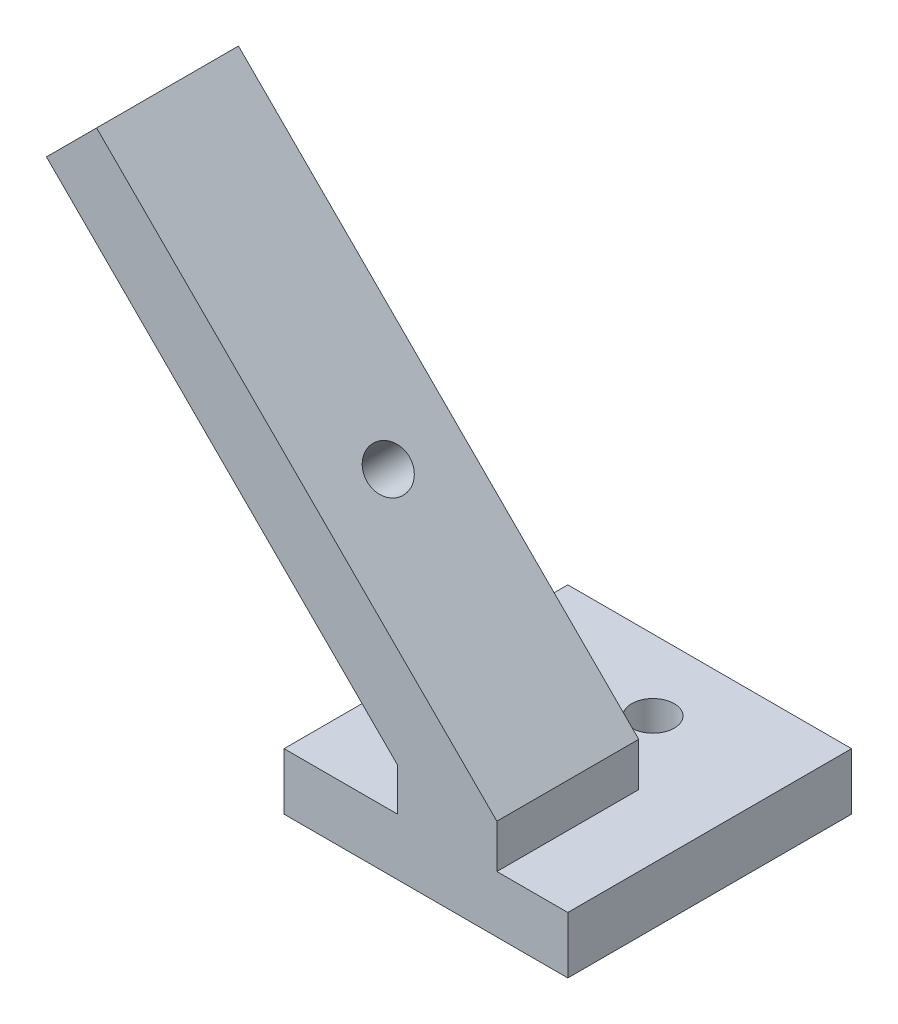
ISO-10303-21;
HEADER;
FILE_DESCRIPTION(('STEP AP214'),'2;1');
FILE_NAME('part.step','',(''),(''),'','','');
FILE_SCHEMA(('AUTOMOTIVE_DESIGN { 1 0 10303 214 1 1 1 1 }'));
ENDSEC;
DATA;
#1=APPLICATION_CONTEXT('core data for automotive mechanical design processes');
#2=APPLICATION_PROTOCOL_DEFINITION('international standard','automotive_design',2000,#1);
#3=PRODUCT_CONTEXT('',#1,'mechanical');
#4=PRODUCT('Part','Part','',(#3));
#5=PRODUCT_RELATED_PRODUCT_CATEGORY('part','',(#4));
#6=PRODUCT_DEFINITION_FORMATION('','',#4);
#7=PRODUCT_DEFINITION_CONTEXT('part definition',#1,'design');
#8=PRODUCT_DEFINITION('design','',#6,#7);
#9=PRODUCT_DEFINITION_SHAPE('','',#8);
#10=(LENGTH_UNIT() NAMED_UNIT(*) SI_UNIT(.MILLI.,.METRE.));
#11=(NAMED_UNIT(*) PLANE_ANGLE_UNIT() SI_UNIT($,.RADIAN.));
#12=(NAMED_UNIT(*) SI_UNIT($,.STERADIAN.) SOLID_ANGLE_UNIT());
#13=UNCERTAINTY_MEASURE_WITH_UNIT(LENGTH_MEASURE(1.E-05),#10,'distance_accuracy_value','');
#14=(GEOMETRIC_REPRESENTATION_CONTEXT(3) GLOBAL_UNCERTAINTY_ASSIGNED_CONTEXT((#13)) GLOBAL_UNIT_ASSIGNED_CONTEXT((#10,
#11,#12)) REPRESENTATION_CONTEXT('',''));
#15=CARTESIAN_POINT('',(0.,0.,0.));
#16=DIRECTION('',(0.,0.,1.));
#17=DIRECTION('',(1.,0.,0.));
#18=AXIS2_PLACEMENT_3D('',#15,#16,#17);
#19=CARTESIAN_POINT('',(0.,7.,10.));
#20=DIRECTION('',(1.,0.,0.));
#21=DIRECTION('',(0.,1.,0.));
#22=AXIS2_PLACEMENT_3D('',#19,#20,#21);
#23=PLANE('',#22);
#24=DIRECTION('',(0.,-1.,0.));
#25=VECTOR('',#24,1.);
#26=CARTESIAN_POINT('',(0.,7.,0.));
#27=LINE('',#26,#25);
#28=CARTESIAN_POINT('',(0.,7.,0.));
#29=VERTEX_POINT('',#28);
#30=CARTESIAN_POINT('',(0.,4.,0.));
#31=VERTEX_POINT('',#30);
#32=EDGE_CURVE('E125',#29,#31,#27,.T.);
#33=ORIENTED_EDGE('',*,*,#32,.T.);
#34=DIRECTION('',(0.,0.,1.));
#35=VECTOR('',#34,1.);
#36=CARTESIAN_POINT('',(0.,4.,10.));
#37=LINE('',#36,#35);
#38=CARTESIAN_POINT('',(0.,4.,10.));
#39=VERTEX_POINT('',#38);
#40=EDGE_CURVE('E129',#31,#39,#37,.T.);
#41=ORIENTED_EDGE('',*,*,#40,.T.);
#42=DIRECTION('',(0.,-1.,0.));
#43=VECTOR('',#42,1.);
#44=CARTESIAN_POINT('',(0.,7.,10.));
#45=LINE('',#44,#43);
#46=CARTESIAN_POINT('',(0.,7.,10.));
#47=VERTEX_POINT('',#46);
#48=EDGE_CURVE('E134',#47,#39,#45,.T.);
#49=ORIENTED_EDGE('',*,*,#48,.F.);
#50=DIRECTION('',(0.,0.,-1.));
#51=VECTOR('',#50,1.);
#52=CARTESIAN_POINT('',(0.,7.,10.));
#53=LINE('',#52,#51);
#54=EDGE_CURVE('E121',#47,#29,#53,.T.);
#55=ORIENTED_EDGE('',*,*,#54,.T.);
#56=EDGE_LOOP('',(#33,#41,#49,#55));
#57=FACE_BOUND('',#56,.T.);
#58=ADVANCED_FACE('F39',(#57),#23,.F.);
#59=CARTESIAN_POINT('',(0.,0.,10.));
#60=DIRECTION('',(0.,1.,0.));
#61=DIRECTION('',(0.,0.,1.));
#62=AXIS2_PLACEMENT_3D('',#59,#60,#61);
#63=PLANE('',#62);
#64=CARTESIAN_POINT('',(-5.,0.,-5.));
#65=DIRECTION('',(0.,1.,0.));
#66=DIRECTION('',(0.,0.,1.));
#67=AXIS2_PLACEMENT_3D('',#64,#65,#66);
#68=CIRCLE('',#67,1.5);
#69=CARTESIAN_POINT('',(-5.,0.,-3.5));
#70=VERTEX_POINT('',#69);
#71=EDGE_CURVE('E346',#70,#70,#68,.T.);
#72=ORIENTED_EDGE('',*,*,#71,.T.);
#73=EDGE_LOOP('',(#72));
#74=FACE_BOUND('',#73,.T.);
#75=CARTESIAN_POINT('',(3.,0.,-5.));
#76=DIRECTION('',(0.,1.,0.));
#77=DIRECTION('',(0.,0.,1.));
#78=AXIS2_PLACEMENT_3D('',#75,#76,#77);
#79=CIRCLE('',#78,1.5);
#80=CARTESIAN_POINT('',(3.,0.,-3.5));
#81=VERTEX_POINT('',#80);
#82=EDGE_CURVE('E347',#81,#81,#79,.T.);
#83=ORIENTED_EDGE('',*,*,#82,.T.);
#84=EDGE_LOOP('',(#83));
#85=FACE_BOUND('',#84,.T.);
#86=DIRECTION('',(1.,0.,0.));
#87=VECTOR('',#86,1.);
#88=CARTESIAN_POINT('',(0.,0.,10.));
#89=LINE('',#88,#87);
#90=CARTESIAN_POINT('',(-8.,0.,10.));
#91=VERTEX_POINT('',#90);
#92=CARTESIAN_POINT('',(12.,0.,10.));
#93=VERTEX_POINT('',#92);
#94=EDGE_CURVE('E88',#91,#93,#89,.T.);
#95=ORIENTED_EDGE('',*,*,#94,.F.);
#96=DIRECTION('',(0.,0.,-1.));
#97=VECTOR('',#96,1.);
#98=CARTESIAN_POINT('',(-8.,0.,10.));
#99=LINE('',#98,#97);
#100=CARTESIAN_POINT('',(-8.,0.,-10.));
#101=VERTEX_POINT('',#100);
#102=EDGE_CURVE('E164',#91,#101,#99,.T.);
#103=ORIENTED_EDGE('',*,*,#102,.T.);
#104=DIRECTION('',(-1.,0.,0.));
#105=VECTOR('',#104,1.);
#106=CARTESIAN_POINT('',(12.,0.,-10.));
#107=LINE('',#106,#105);
#108=CARTESIAN_POINT('',(12.,0.,-10.));
#109=VERTEX_POINT('',#108);
#110=EDGE_CURVE('E161',#109,#101,#107,.T.);
#111=ORIENTED_EDGE('',*,*,#110,.F.);
#112=DIRECTION('',(0.,0.,-1.));
#113=VECTOR('',#112,1.);
#114=CARTESIAN_POINT('',(12.,0.,10.));
#115=LINE('',#114,#113);
#116=EDGE_CURVE('E48',#93,#109,#115,.T.);
#117=ORIENTED_EDGE('',*,*,#116,.F.);
#118=EDGE_LOOP('',(#95,#103,#111,#117));
#119=FACE_BOUND('',#118,.T.);
#120=ADVANCED_FACE('F162',(#74,#85,#119),#63,.F.);
#121=CARTESIAN_POINT('',(12.,0.,10.));
#122=DIRECTION('',(-1.,0.,0.));
#123=DIRECTION('',(0.,0.,1.));
#124=AXIS2_PLACEMENT_3D('',#121,#122,#123);
#125=PLANE('',#124);
#126=ORIENTED_EDGE('',*,*,#116,.T.);
#127=DIRECTION('',(0.,-1.,0.));
#128=VECTOR('',#127,1.);
#129=CARTESIAN_POINT('',(12.,4.,-10.));
#130=LINE('',#129,#128);
#131=CARTESIAN_POINT('',(12.,4.,-10.));
#132=VERTEX_POINT('',#131);
#133=EDGE_CURVE('E154',#132,#109,#130,.T.);
#134=ORIENTED_EDGE('',*,*,#133,.F.);
#135=DIRECTION('',(0.,0.,-1.));
#136=VECTOR('',#135,1.);
#137=CARTESIAN_POINT('',(12.,4.,10.));
#138=LINE('',#137,#136);
#139=CARTESIAN_POINT('',(12.,4.,10.));
#140=VERTEX_POINT('',#139);
#141=EDGE_CURVE('E141',#140,#132,#138,.T.);
#142=ORIENTED_EDGE('',*,*,#141,.F.);
#143=DIRECTION('',(0.,1.,0.));
#144=VECTOR('',#143,1.);
#145=CARTESIAN_POINT('',(12.,0.,10.));
#146=LINE('',#145,#144);
#147=EDGE_CURVE('E155',#93,#140,#146,.T.);
#148=ORIENTED_EDGE('',*,*,#147,.F.);
#149=EDGE_LOOP('',(#126,#134,#142,#148));
#150=FACE_BOUND('',#149,.T.);
#151=ADVANCED_FACE('F150',(#150),#125,.F.);
#152=CARTESIAN_POINT('',(12.,4.,10.));
#153=DIRECTION('',(0.,-1.,0.));
#154=DIRECTION('',(1.,0.,0.));
#155=AXIS2_PLACEMENT_3D('',#152,#153,#154);
#156=PLANE('',#155);
#157=CARTESIAN_POINT('',(-5.,4.,-5.));
#158=DIRECTION('',(0.,1.,0.));
#159=DIRECTION('',(-1.,0.,0.));
#160=AXIS2_PLACEMENT_3D('',#157,#158,#159);
#161=CIRCLE('',#160,1.5);
#162=CARTESIAN_POINT('',(-6.5,4.,-5.));
#163=VERTEX_POINT('',#162);
#164=EDGE_CURVE('E344',#163,#163,#161,.T.);
#165=ORIENTED_EDGE('',*,*,#164,.F.);
#166=EDGE_LOOP('',(#165));
#167=FACE_BOUND('',#166,.T.);
#168=CARTESIAN_POINT('',(3.,4.,-5.));
#169=DIRECTION('',(0.,1.,0.));
#170=DIRECTION('',(-1.,0.,0.));
#171=AXIS2_PLACEMENT_3D('',#168,#169,#170);
#172=CIRCLE('',#171,1.5);
#173=CARTESIAN_POINT('',(1.5,4.,-5.));
#174=VERTEX_POINT('',#173);
#175=EDGE_CURVE('E352',#174,#174,#172,.T.);
#176=ORIENTED_EDGE('',*,*,#175,.F.);
#177=EDGE_LOOP('',(#176));
#178=FACE_BOUND('',#177,.T.);
#179=ORIENTED_EDGE('',*,*,#141,.T.);
#180=DIRECTION('',(1.,0.,0.));
#181=VECTOR('',#180,1.);
#182=CARTESIAN_POINT('',(12.,4.,-10.));
#183=LINE('',#182,#181);
#184=CARTESIAN_POINT('',(-8.,4.,-10.));
#185=VERTEX_POINT('',#184);
#186=EDGE_CURVE('E173',#185,#132,#183,.T.);
#187=ORIENTED_EDGE('',*,*,#186,.F.);
#188=DIRECTION('',(0.,0.,-1.));
#189=VECTOR('',#188,1.);
#190=CARTESIAN_POINT('',(-8.,4.,10.));
#191=LINE('',#190,#189);
#192=CARTESIAN_POINT('',(-8.,4.,10.));
#193=VERTEX_POINT('',#192);
#194=EDGE_CURVE('E188',#193,#185,#191,.T.);
#195=ORIENTED_EDGE('',*,*,#194,.F.);
#196=DIRECTION('',(1.,0.,0.));
#197=VECTOR('',#196,1.);
#198=CARTESIAN_POINT('',(12.,4.,10.));
#199=LINE('',#198,#197);
#200=EDGE_CURVE('E185',#193,#39,#199,.T.);
#201=ORIENTED_EDGE('',*,*,#200,.T.);
#202=ORIENTED_EDGE('',*,*,#40,.F.);
#203=DIRECTION('',(-1.,0.,0.));
#204=VECTOR('',#203,1.);
#205=CARTESIAN_POINT('',(0.,4.,0.));
#206=LINE('',#205,#204);
#207=CARTESIAN_POINT('',(7.,4.,0.));
#208=VERTEX_POINT('',#207);
#209=EDGE_CURVE('E11',#208,#31,#206,.T.);
#210=ORIENTED_EDGE('',*,*,#209,.F.);
#211=DIRECTION('',(0.,0.,-1.));
#212=VECTOR('',#211,1.);
#213=CARTESIAN_POINT('',(7.,4.,10.));
#214=LINE('',#213,#212);
#215=CARTESIAN_POINT('',(7.,4.,10.));
#216=VERTEX_POINT('',#215);
#217=EDGE_CURVE('E138',#216,#208,#214,.T.);
#218=ORIENTED_EDGE('',*,*,#217,.F.);
#219=DIRECTION('',(-1.,0.,0.));
#220=VECTOR('',#219,1.);
#221=CARTESIAN_POINT('',(12.,4.,10.));
#222=LINE('',#221,#220);
#223=EDGE_CURVE('E197',#140,#216,#222,.T.);
#224=ORIENTED_EDGE('',*,*,#223,.F.);
#225=EDGE_LOOP('',(#179,#187,#195,#201,#202,#210,#218,#224));
#226=FACE_BOUND('',#225,.T.);
#227=ADVANCED_FACE('F202',(#167,#178,#226),#156,.F.);
#228=CARTESIAN_POINT('',(7.,4.,10.));
#229=DIRECTION('',(-1.,0.,0.));
#230=DIRECTION('',(0.,0.,1.));
#231=AXIS2_PLACEMENT_3D('',#228,#229,#230);
#232=PLANE('',#231);
#233=DIRECTION('',(0.,1.,0.));
#234=VECTOR('',#233,1.);
#235=CARTESIAN_POINT('',(7.,4.,0.));
#236=LINE('',#235,#234);
#237=CARTESIAN_POINT('',(7.,7.07106781186545,0.));
#238=VERTEX_POINT('',#237);
#239=EDGE_CURVE('E128',#208,#238,#236,.T.);
#240=ORIENTED_EDGE('',*,*,#239,.T.);
#241=DIRECTION('',(0.,0.,-1.));
#242=VECTOR('',#241,1.);
#243=CARTESIAN_POINT('',(7.,7.07106781186545,10.));
#244=LINE('',#243,#242);
#245=CARTESIAN_POINT('',(7.,7.07106781186545,10.));
#246=VERTEX_POINT('',#245);
#247=EDGE_CURVE('E116',#246,#238,#244,.T.);
#248=ORIENTED_EDGE('',*,*,#247,.F.);
#249=DIRECTION('',(0.,1.,0.));
#250=VECTOR('',#249,1.);
#251=CARTESIAN_POINT('',(7.,4.,10.));
#252=LINE('',#251,#250);
#253=EDGE_CURVE('E107',#216,#246,#252,.T.);
#254=ORIENTED_EDGE('',*,*,#253,.F.);
#255=ORIENTED_EDGE('',*,*,#217,.T.);
#256=EDGE_LOOP('',(#240,#248,#254,#255));
#257=FACE_BOUND('',#256,.T.);
#258=ADVANCED_FACE('F207',(#257),#232,.F.);
#259=CARTESIAN_POINT('',(7.,7.07106781186545,10.));
#260=DIRECTION('',(-0.707106781186546,-0.707106781186549,0.));
#261=DIRECTION('',(0.707106781186549,-0.707106781186546,0.));
#262=AXIS2_PLACEMENT_3D('',#259,#260,#261);
#263=PLANE('',#262);
#264=CARTESIAN_POINT('',(-5.65685424949242,19.7279220613578,5.));
#265=DIRECTION('',(0.707106781186546,0.707106781186549,0.));
#266=DIRECTION('',(-0.707106781186549,0.707106781186546,0.));
#267=AXIS2_PLACEMENT_3D('',#264,#265,#266);
#268=CIRCLE('',#267,1.5);
#269=CARTESIAN_POINT('',(-6.71751442127225,20.7885822331377,5.));
#270=VERTEX_POINT('',#269);
#271=EDGE_CURVE('E176',#270,#270,#268,.T.);
#272=ORIENTED_EDGE('',*,*,#271,.F.);
#273=EDGE_LOOP('',(#272));
#274=FACE_BOUND('',#273,.T.);
#275=DIRECTION('',(-0.707106781186549,0.707106781186546,0.));
#276=VECTOR('',#275,1.);
#277=CARTESIAN_POINT('',(7.,7.07106781186545,0.));
#278=LINE('',#277,#276);
#279=CARTESIAN_POINT('',(-21.2132034355965,35.2842712474619,0.));
#280=VERTEX_POINT('',#279);
#281=EDGE_CURVE('E115',#238,#280,#278,.T.);
#282=ORIENTED_EDGE('',*,*,#281,.T.);
#283=DIRECTION('',(0.,0.,-1.));
#284=VECTOR('',#283,1.);
#285=CARTESIAN_POINT('',(-21.2132034355965,35.2842712474619,10.));
#286=LINE('',#285,#284);
#287=CARTESIAN_POINT('',(-21.2132034355965,35.2842712474619,10.));
#288=VERTEX_POINT('',#287);
#289=EDGE_CURVE('E112',#288,#280,#286,.T.);
#290=ORIENTED_EDGE('',*,*,#289,.F.);
#291=DIRECTION('',(-0.707106781186549,0.707106781186546,0.));
#292=VECTOR('',#291,1.);
#293=CARTESIAN_POINT('',(7.,7.07106781186545,10.));
#294=LINE('',#293,#292);
#295=EDGE_CURVE('E101',#246,#288,#294,.T.);
#296=ORIENTED_EDGE('',*,*,#295,.F.);
#297=ORIENTED_EDGE('',*,*,#247,.T.);
#298=EDGE_LOOP('',(#282,#290,#296,#297));
#299=FACE_BOUND('',#298,.T.);
#300=ADVANCED_FACE('F113',(#274,#299),#263,.F.);
#301=CARTESIAN_POINT('',(-21.2132034355965,35.2842712474619,10.));
#302=DIRECTION('',(0.707106781186549,-0.707106781186546,0.));
#303=DIRECTION('',(0.707106781186546,0.707106781186549,0.));
#304=AXIS2_PLACEMENT_3D('',#301,#302,#303);
#305=PLANE('',#304);
#306=DIRECTION('',(-0.707106781186546,-0.707106781186549,0.));
#307=VECTOR('',#306,1.);
#308=CARTESIAN_POINT('',(-21.2132034355965,35.2842712474619,0.));
#309=LINE('',#308,#307);
#310=CARTESIAN_POINT('',(-24.7487373415292,31.7487373415291,0.));
#311=VERTEX_POINT('',#310);
#312=EDGE_CURVE('E74',#280,#311,#309,.T.);
#313=ORIENTED_EDGE('',*,*,#312,.T.);
#314=DIRECTION('',(0.,0.,-1.));
#315=VECTOR('',#314,1.);
#316=CARTESIAN_POINT('',(-24.7487373415292,31.7487373415291,10.));
#317=LINE('',#316,#315);
#318=CARTESIAN_POINT('',(-24.7487373415292,31.7487373415291,10.));
#319=VERTEX_POINT('',#318);
#320=EDGE_CURVE('E117',#319,#311,#317,.T.);
#321=ORIENTED_EDGE('',*,*,#320,.F.);
#322=DIRECTION('',(-0.707106781186546,-0.707106781186549,0.));
#323=VECTOR('',#322,1.);
#324=CARTESIAN_POINT('',(-21.2132034355965,35.2842712474619,10.));
#325=LINE('',#324,#323);
#326=EDGE_CURVE('E105',#288,#319,#325,.T.);
#327=ORIENTED_EDGE('',*,*,#326,.F.);
#328=ORIENTED_EDGE('',*,*,#289,.T.);
#329=EDGE_LOOP('',(#313,#321,#327,#328));
#330=FACE_BOUND('',#329,.T.);
#331=ADVANCED_FACE('F119',(#330),#305,.F.);
#332=CARTESIAN_POINT('',(-24.7487373415292,31.7487373415291,10.));
#333=DIRECTION('',(0.707106781186546,0.707106781186549,0.));
#334=DIRECTION('',(-0.707106781186549,0.707106781186546,0.));
#335=AXIS2_PLACEMENT_3D('',#332,#333,#334);
#336=PLANE('',#335);
#337=CARTESIAN_POINT('',(-9.19238815542515,16.1923881554251,5.));
#338=DIRECTION('',(0.707106781186546,0.707106781186549,0.));
#339=DIRECTION('',(-0.707106781186549,0.707106781186546,0.));
#340=AXIS2_PLACEMENT_3D('',#337,#338,#339);
#341=CIRCLE('',#340,1.5);
#342=CARTESIAN_POINT('',(-10.253048327205,17.2530483272049,5.));
#343=VERTEX_POINT('',#342);
#344=EDGE_CURVE('E42',#343,#343,#341,.T.);
#345=ORIENTED_EDGE('',*,*,#344,.T.);
#346=EDGE_LOOP('',(#345));
#347=FACE_BOUND('',#346,.T.);
#348=DIRECTION('',(0.707106781186549,-0.707106781186546,0.));
#349=VECTOR('',#348,1.);
#350=CARTESIAN_POINT('',(-24.7487373415292,31.7487373415291,0.));
#351=LINE('',#350,#349);
#352=EDGE_CURVE('E80',#311,#29,#351,.T.);
#353=ORIENTED_EDGE('',*,*,#352,.T.);
#354=ORIENTED_EDGE('',*,*,#54,.F.);
#355=DIRECTION('',(0.707106781186549,-0.707106781186546,0.));
#356=VECTOR('',#355,1.);
#357=CARTESIAN_POINT('',(-24.7487373415292,31.7487373415291,10.));
#358=LINE('',#357,#356);
#359=EDGE_CURVE('E56',#319,#47,#358,.T.);
#360=ORIENTED_EDGE('',*,*,#359,.F.);
#361=ORIENTED_EDGE('',*,*,#320,.T.);
#362=EDGE_LOOP('',(#353,#354,#360,#361));
#363=FACE_BOUND('',#362,.T.);
#364=ADVANCED_FACE('F259',(#347,#363),#336,.F.);
#365=CARTESIAN_POINT('',(0.,0.,10.));
#366=DIRECTION('',(0.,0.,1.));
#367=DIRECTION('',(1.,0.,0.));
#368=AXIS2_PLACEMENT_3D('',#365,#366,#367);
#369=PLANE('',#368);
#370=ORIENTED_EDGE('',*,*,#48,.T.);
#371=ORIENTED_EDGE('',*,*,#200,.F.);
#372=DIRECTION('',(0.,1.,0.));
#373=VECTOR('',#372,1.);
#374=CARTESIAN_POINT('',(-8.,4.,10.));
#375=LINE('',#374,#373);
#376=EDGE_CURVE('E182',#91,#193,#375,.T.);
#377=ORIENTED_EDGE('',*,*,#376,.F.);
#378=ORIENTED_EDGE('',*,*,#94,.T.);
#379=ORIENTED_EDGE('',*,*,#147,.T.);
#380=ORIENTED_EDGE('',*,*,#223,.T.);
#381=ORIENTED_EDGE('',*,*,#253,.T.);
#382=ORIENTED_EDGE('',*,*,#295,.T.);
#383=ORIENTED_EDGE('',*,*,#326,.T.);
#384=ORIENTED_EDGE('',*,*,#359,.T.);
#385=EDGE_LOOP('',(#370,#371,#377,#378,#379,#380,#381,#382,#383,#384));
#386=FACE_BOUND('',#385,.T.);
#387=ADVANCED_FACE('F103',(#386),#369,.T.);
#388=CARTESIAN_POINT('',(0.,0.,0.));
#389=DIRECTION('',(0.,0.,1.));
#390=DIRECTION('',(1.,0.,0.));
#391=AXIS2_PLACEMENT_3D('',#388,#389,#390);
#392=PLANE('',#391);
#393=ORIENTED_EDGE('',*,*,#239,.F.);
#394=ORIENTED_EDGE('',*,*,#209,.T.);
#395=ORIENTED_EDGE('',*,*,#32,.F.);
#396=ORIENTED_EDGE('',*,*,#352,.F.);
#397=ORIENTED_EDGE('',*,*,#312,.F.);
#398=ORIENTED_EDGE('',*,*,#281,.F.);
#399=EDGE_LOOP('',(#393,#394,#395,#396,#397,#398));
#400=FACE_BOUND('',#399,.T.);
#401=ADVANCED_FACE('F209',(#400),#392,.F.);
#402=CARTESIAN_POINT('',(-8.,4.,10.));
#403=DIRECTION('',(-1.,0.,0.));
#404=DIRECTION('',(0.,0.,1.));
#405=AXIS2_PLACEMENT_3D('',#402,#403,#404);
#406=PLANE('',#405);
#407=ORIENTED_EDGE('',*,*,#194,.T.);
#408=DIRECTION('',(0.,1.,0.));
#409=VECTOR('',#408,1.);
#410=CARTESIAN_POINT('',(-8.,4.,-10.));
#411=LINE('',#410,#409);
#412=EDGE_CURVE('E168',#101,#185,#411,.T.);
#413=ORIENTED_EDGE('',*,*,#412,.F.);
#414=ORIENTED_EDGE('',*,*,#102,.F.);
#415=ORIENTED_EDGE('',*,*,#376,.T.);
#416=EDGE_LOOP('',(#407,#413,#414,#415));
#417=FACE_BOUND('',#416,.T.);
#418=ADVANCED_FACE('F225',(#417),#406,.T.);
#419=CARTESIAN_POINT('',(0.,0.,-10.));
#420=DIRECTION('',(0.,0.,-1.));
#421=DIRECTION('',(-1.,0.,0.));
#422=AXIS2_PLACEMENT_3D('',#419,#420,#421);
#423=PLANE('',#422);
#424=ORIENTED_EDGE('',*,*,#133,.T.);
#425=ORIENTED_EDGE('',*,*,#110,.T.);
#426=ORIENTED_EDGE('',*,*,#412,.T.);
#427=ORIENTED_EDGE('',*,*,#186,.T.);
#428=EDGE_LOOP('',(#424,#425,#426,#427));
#429=FACE_BOUND('',#428,.T.);
#430=ADVANCED_FACE('F171',(#429),#423,.T.);
#431=CARTESIAN_POINT('',(-12.7279220613579,12.6568542494924,5.));
#432=DIRECTION('',(0.707106781186546,0.707106781186549,0.));
#433=DIRECTION('',(-0.707106781186549,0.707106781186546,0.));
#434=AXIS2_PLACEMENT_3D('',#431,#432,#433);
#435=CYLINDRICAL_SURFACE('',#434,1.5);
#436=ORIENTED_EDGE('',*,*,#271,.T.);
#437=EDGE_LOOP('',(#436));
#438=FACE_BOUND('',#437,.T.);
#439=ORIENTED_EDGE('',*,*,#344,.F.);
#440=EDGE_LOOP('',(#439));
#441=FACE_BOUND('',#440,.T.);
#442=ADVANCED_FACE('F233',(#438,#441),#435,.F.);
#443=CARTESIAN_POINT('',(3.,-6.,-5.));
#444=DIRECTION('',(0.,1.,0.));
#445=DIRECTION('',(-1.,0.,0.));
#446=AXIS2_PLACEMENT_3D('',#443,#444,#445);
#447=CYLINDRICAL_SURFACE('',#446,1.5);
#448=ORIENTED_EDGE('',*,*,#175,.T.);
#449=EDGE_LOOP('',(#448));
#450=FACE_BOUND('',#449,.T.);
#451=ORIENTED_EDGE('',*,*,#82,.F.);
#452=EDGE_LOOP('',(#451));
#453=FACE_BOUND('',#452,.T.);
#454=ADVANCED_FACE('F304',(#450,#453),#447,.F.);
#455=CARTESIAN_POINT('',(-5.,-6.,-5.));
#456=DIRECTION('',(0.,1.,0.));
#457=DIRECTION('',(-1.,0.,0.));
#458=AXIS2_PLACEMENT_3D('',#455,#456,#457);
#459=CYLINDRICAL_SURFACE('',#458,1.5);
#460=ORIENTED_EDGE('',*,*,#164,.T.);
#461=EDGE_LOOP('',(#460));
#462=FACE_BOUND('',#461,.T.);
#463=ORIENTED_EDGE('',*,*,#71,.F.);
#464=EDGE_LOOP('',(#463));
#465=FACE_BOUND('',#464,.T.);
#466=ADVANCED_FACE('F327',(#462,#465),#459,.F.);
#467=CLOSED_SHELL('',(#58,#120,#151,#227,#258,#300,#331,#364,#387,#401,#418,#430,#442,#454,#466));
#468=MANIFOLD_SOLID_BREP('B2',#467);
#469=ADVANCED_BREP_SHAPE_REPRESENTATION('',(#18,#468),#14);
#470=SHAPE_DEFINITION_REPRESENTATION(#9,#469);
ENDSEC;
END-ISO-10303-21;
